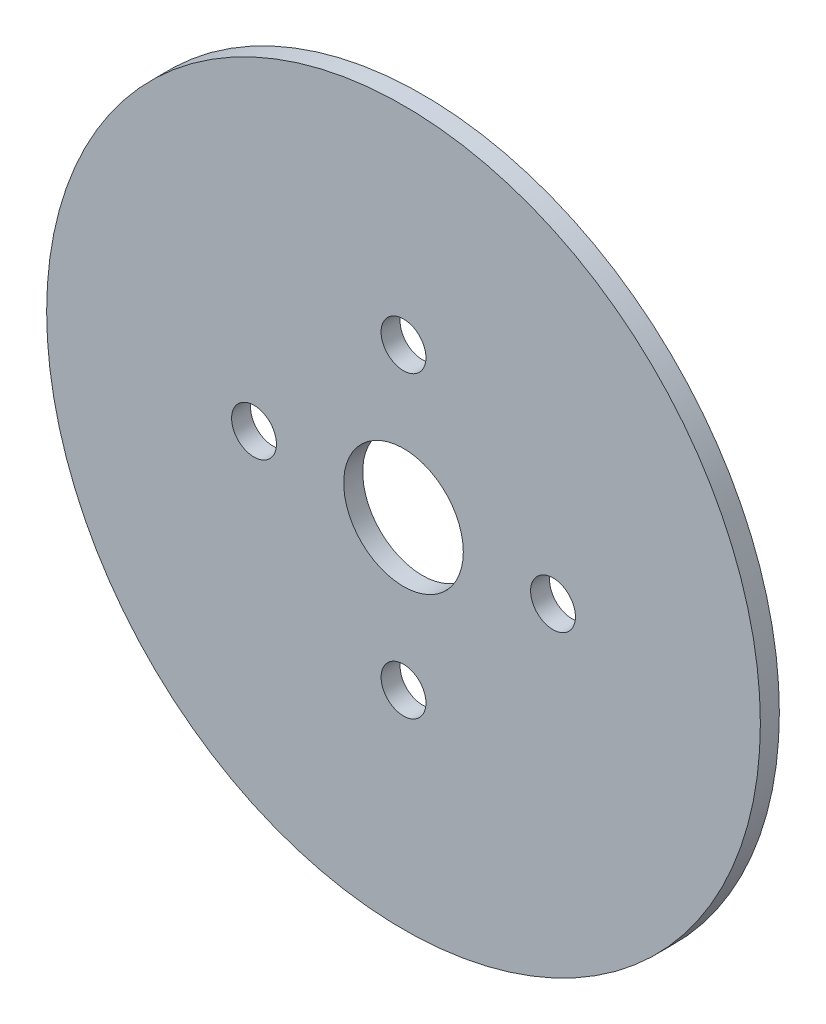
ISO-10303-21;
HEADER;
FILE_DESCRIPTION(('STEP AP214'),'2;1');
FILE_NAME('part.step','',(''),(''),'','','');
FILE_SCHEMA(('AUTOMOTIVE_DESIGN { 1 0 10303 214 1 1 1 1 }'));
ENDSEC;
DATA;
#1=APPLICATION_CONTEXT('core data for automotive mechanical design processes');
#2=APPLICATION_PROTOCOL_DEFINITION('international standard','automotive_design',2000,#1);
#3=PRODUCT_CONTEXT('',#1,'mechanical');
#4=PRODUCT('Part','Part','',(#3));
#5=PRODUCT_RELATED_PRODUCT_CATEGORY('part','',(#4));
#6=PRODUCT_DEFINITION_FORMATION('','',#4);
#7=PRODUCT_DEFINITION_CONTEXT('part definition',#1,'design');
#8=PRODUCT_DEFINITION('design','',#6,#7);
#9=PRODUCT_DEFINITION_SHAPE('','',#8);
#10=(LENGTH_UNIT() NAMED_UNIT(*) SI_UNIT(.MILLI.,.METRE.));
#11=(NAMED_UNIT(*) PLANE_ANGLE_UNIT() SI_UNIT($,.RADIAN.));
#12=(NAMED_UNIT(*) SI_UNIT($,.STERADIAN.) SOLID_ANGLE_UNIT());
#13=UNCERTAINTY_MEASURE_WITH_UNIT(LENGTH_MEASURE(1.E-05),#10,'distance_accuracy_value','');
#14=(GEOMETRIC_REPRESENTATION_CONTEXT(3) GLOBAL_UNCERTAINTY_ASSIGNED_CONTEXT((#13)) GLOBAL_UNIT_ASSIGNED_CONTEXT((#10,
#11,#12)) REPRESENTATION_CONTEXT('',''));
#15=CARTESIAN_POINT('',(0.,0.,0.));
#16=DIRECTION('',(0.,0.,1.));
#17=DIRECTION('',(1.,0.,0.));
#18=AXIS2_PLACEMENT_3D('',#15,#16,#17);
#19=CARTESIAN_POINT('',(0.,0.,1.27));
#20=DIRECTION('',(0.,0.,1.));
#21=DIRECTION('',(1.,0.,0.));
#22=AXIS2_PLACEMENT_3D('',#19,#20,#21);
#23=PLANE('',#22);
#24=CARTESIAN_POINT('',(2.8176792204172E-13,-10.,1.27));
#25=DIRECTION('',(0.,0.,1.));
#26=DIRECTION('',(1.,0.,0.));
#27=AXIS2_PLACEMENT_3D('',#24,#25,#26);
#28=CIRCLE('',#27,1.50000000000034);
#29=CARTESIAN_POINT('',(1.50000000000062,-10.,1.27));
#30=VERTEX_POINT('',#29);
#31=EDGE_CURVE('E59',#30,#30,#28,.T.);
#32=ORIENTED_EDGE('',*,*,#31,.F.);
#33=EDGE_LOOP('',(#32));
#34=FACE_BOUND('',#33,.T.);
#35=CARTESIAN_POINT('',(0.,0.,1.27));
#36=DIRECTION('',(0.,0.,1.));
#37=DIRECTION('',(1.,0.,0.));
#38=AXIS2_PLACEMENT_3D('',#35,#36,#37);
#39=CIRCLE('',#38,4.);
#40=CARTESIAN_POINT('',(4.,0.,1.27));
#41=VERTEX_POINT('',#40);
#42=EDGE_CURVE('E47',#41,#41,#39,.T.);
#43=ORIENTED_EDGE('',*,*,#42,.F.);
#44=EDGE_LOOP('',(#43));
#45=FACE_BOUND('',#44,.T.);
#46=CARTESIAN_POINT('',(0.,0.,1.27));
#47=DIRECTION('',(0.,0.,1.));
#48=DIRECTION('',(1.,0.,0.));
#49=AXIS2_PLACEMENT_3D('',#46,#47,#48);
#50=CIRCLE('',#49,23.87);
#51=CARTESIAN_POINT('',(23.87,0.,1.27));
#52=VERTEX_POINT('',#51);
#53=EDGE_CURVE('E10',#52,#52,#50,.T.);
#54=ORIENTED_EDGE('',*,*,#53,.T.);
#55=EDGE_LOOP('',(#54));
#56=FACE_BOUND('',#55,.T.);
#57=CARTESIAN_POINT('',(0.,10.,1.27));
#58=DIRECTION('',(0.,0.,1.));
#59=DIRECTION('',(1.,0.,0.));
#60=AXIS2_PLACEMENT_3D('',#57,#58,#59);
#61=CIRCLE('',#60,1.5);
#62=CARTESIAN_POINT('',(1.5,10.,1.27));
#63=VERTEX_POINT('',#62);
#64=EDGE_CURVE('E42',#63,#63,#61,.T.);
#65=ORIENTED_EDGE('',*,*,#64,.F.);
#66=EDGE_LOOP('',(#65));
#67=FACE_BOUND('',#66,.T.);
#68=CARTESIAN_POINT('',(10.,0.,1.27));
#69=DIRECTION('',(0.,0.,1.));
#70=DIRECTION('',(1.,0.,0.));
#71=AXIS2_PLACEMENT_3D('',#68,#69,#70);
#72=CIRCLE('',#71,1.5);
#73=CARTESIAN_POINT('',(11.5,0.,1.27));
#74=VERTEX_POINT('',#73);
#75=EDGE_CURVE('E53',#74,#74,#72,.T.);
#76=ORIENTED_EDGE('',*,*,#75,.F.);
#77=EDGE_LOOP('',(#76));
#78=FACE_BOUND('',#77,.T.);
#79=CARTESIAN_POINT('',(-9.99999999999986,-1.39659314221713E-13,1.27));
#80=DIRECTION('',(0.,0.,1.));
#81=DIRECTION('',(1.,0.,0.));
#82=AXIS2_PLACEMENT_3D('',#79,#80,#81);
#83=CIRCLE('',#82,1.50000000000027);
#84=CARTESIAN_POINT('',(-8.49999999999959,-1.39659314221713E-13,1.27));
#85=VERTEX_POINT('',#84);
#86=EDGE_CURVE('E65',#85,#85,#83,.T.);
#87=ORIENTED_EDGE('',*,*,#86,.F.);
#88=EDGE_LOOP('',(#87));
#89=FACE_BOUND('',#88,.T.);
#90=ADVANCED_FACE('F31',(#34,#45,#56,#67,#78,#89),#23,.T.);
#91=CARTESIAN_POINT('',(0.,0.,0.));
#92=DIRECTION('',(0.,0.,1.));
#93=DIRECTION('',(1.,0.,0.));
#94=AXIS2_PLACEMENT_3D('',#91,#92,#93);
#95=PLANE('',#94);
#96=CARTESIAN_POINT('',(2.8176792204172E-13,-10.,0.));
#97=DIRECTION('',(0.,0.,1.));
#98=DIRECTION('',(1.,0.,0.));
#99=AXIS2_PLACEMENT_3D('',#96,#97,#98);
#100=CIRCLE('',#99,1.50000000000034);
#101=CARTESIAN_POINT('',(1.50000000000062,-10.,0.));
#102=VERTEX_POINT('',#101);
#103=EDGE_CURVE('E62',#102,#102,#100,.T.);
#104=ORIENTED_EDGE('',*,*,#103,.T.);
#105=EDGE_LOOP('',(#104));
#106=FACE_BOUND('',#105,.T.);
#107=CARTESIAN_POINT('',(0.,0.,0.));
#108=DIRECTION('',(0.,0.,1.));
#109=DIRECTION('',(1.,0.,0.));
#110=AXIS2_PLACEMENT_3D('',#107,#108,#109);
#111=CIRCLE('',#110,4.);
#112=CARTESIAN_POINT('',(4.,0.,0.));
#113=VERTEX_POINT('',#112);
#114=EDGE_CURVE('E50',#113,#113,#111,.T.);
#115=ORIENTED_EDGE('',*,*,#114,.T.);
#116=EDGE_LOOP('',(#115));
#117=FACE_BOUND('',#116,.T.);
#118=CARTESIAN_POINT('',(0.,0.,0.));
#119=DIRECTION('',(0.,0.,1.));
#120=DIRECTION('',(1.,0.,0.));
#121=AXIS2_PLACEMENT_3D('',#118,#119,#120);
#122=CIRCLE('',#121,23.87);
#123=CARTESIAN_POINT('',(23.87,0.,0.));
#124=VERTEX_POINT('',#123);
#125=EDGE_CURVE('E35',#124,#124,#122,.T.);
#126=ORIENTED_EDGE('',*,*,#125,.F.);
#127=EDGE_LOOP('',(#126));
#128=FACE_BOUND('',#127,.T.);
#129=CARTESIAN_POINT('',(0.,10.,0.));
#130=DIRECTION('',(0.,0.,1.));
#131=DIRECTION('',(1.,0.,0.));
#132=AXIS2_PLACEMENT_3D('',#129,#130,#131);
#133=CIRCLE('',#132,1.5);
#134=CARTESIAN_POINT('',(1.5,10.,0.));
#135=VERTEX_POINT('',#134);
#136=EDGE_CURVE('E44',#135,#135,#133,.T.);
#137=ORIENTED_EDGE('',*,*,#136,.T.);
#138=EDGE_LOOP('',(#137));
#139=FACE_BOUND('',#138,.T.);
#140=CARTESIAN_POINT('',(10.,0.,0.));
#141=DIRECTION('',(0.,0.,1.));
#142=DIRECTION('',(1.,0.,0.));
#143=AXIS2_PLACEMENT_3D('',#140,#141,#142);
#144=CIRCLE('',#143,1.5);
#145=CARTESIAN_POINT('',(11.5,0.,0.));
#146=VERTEX_POINT('',#145);
#147=EDGE_CURVE('E56',#146,#146,#144,.T.);
#148=ORIENTED_EDGE('',*,*,#147,.T.);
#149=EDGE_LOOP('',(#148));
#150=FACE_BOUND('',#149,.T.);
#151=CARTESIAN_POINT('',(-9.99999999999986,-1.39659314221713E-13,0.));
#152=DIRECTION('',(0.,0.,1.));
#153=DIRECTION('',(1.,0.,0.));
#154=AXIS2_PLACEMENT_3D('',#151,#152,#153);
#155=CIRCLE('',#154,1.50000000000027);
#156=CARTESIAN_POINT('',(-8.49999999999959,-1.39659314221713E-13,0.));
#157=VERTEX_POINT('',#156);
#158=EDGE_CURVE('E68',#157,#157,#155,.T.);
#159=ORIENTED_EDGE('',*,*,#158,.T.);
#160=EDGE_LOOP('',(#159));
#161=FACE_BOUND('',#160,.T.);
#162=ADVANCED_FACE('F78',(#106,#117,#128,#139,#150,#161),#95,.F.);
#163=CARTESIAN_POINT('',(0.,0.,1.27));
#164=DIRECTION('',(0.,0.,-1.));
#165=DIRECTION('',(-1.,0.,0.));
#166=AXIS2_PLACEMENT_3D('',#163,#164,#165);
#167=CYLINDRICAL_SURFACE('',#166,23.87);
#168=ORIENTED_EDGE('',*,*,#53,.F.);
#169=EDGE_LOOP('',(#168));
#170=FACE_BOUND('',#169,.T.);
#171=ORIENTED_EDGE('',*,*,#125,.T.);
#172=EDGE_LOOP('',(#171));
#173=FACE_BOUND('',#172,.T.);
#174=ADVANCED_FACE('F33',(#170,#173),#167,.T.);
#175=CARTESIAN_POINT('',(0.,10.,1.27));
#176=DIRECTION('',(0.,0.,-1.));
#177=DIRECTION('',(-1.,0.,0.));
#178=AXIS2_PLACEMENT_3D('',#175,#176,#177);
#179=CYLINDRICAL_SURFACE('',#178,1.5);
#180=ORIENTED_EDGE('',*,*,#64,.T.);
#181=EDGE_LOOP('',(#180));
#182=FACE_BOUND('',#181,.T.);
#183=ORIENTED_EDGE('',*,*,#136,.F.);
#184=EDGE_LOOP('',(#183));
#185=FACE_BOUND('',#184,.T.);
#186=ADVANCED_FACE('F88',(#182,#185),#179,.F.);
#187=CARTESIAN_POINT('',(0.,0.,1.27));
#188=DIRECTION('',(0.,0.,-1.));
#189=DIRECTION('',(-1.,0.,0.));
#190=AXIS2_PLACEMENT_3D('',#187,#188,#189);
#191=CYLINDRICAL_SURFACE('',#190,4.);
#192=ORIENTED_EDGE('',*,*,#42,.T.);
#193=EDGE_LOOP('',(#192));
#194=FACE_BOUND('',#193,.T.);
#195=ORIENTED_EDGE('',*,*,#114,.F.);
#196=EDGE_LOOP('',(#195));
#197=FACE_BOUND('',#196,.T.);
#198=ADVANCED_FACE('F91',(#194,#197),#191,.F.);
#199=CARTESIAN_POINT('',(10.,0.,1.27));
#200=DIRECTION('',(0.,0.,-1.));
#201=DIRECTION('',(-1.,0.,0.));
#202=AXIS2_PLACEMENT_3D('',#199,#200,#201);
#203=CYLINDRICAL_SURFACE('',#202,1.5);
#204=ORIENTED_EDGE('',*,*,#75,.T.);
#205=EDGE_LOOP('',(#204));
#206=FACE_BOUND('',#205,.T.);
#207=ORIENTED_EDGE('',*,*,#147,.F.);
#208=EDGE_LOOP('',(#207));
#209=FACE_BOUND('',#208,.T.);
#210=ADVANCED_FACE('F95',(#206,#209),#203,.F.);
#211=CARTESIAN_POINT('',(2.8176792204172E-13,-10.,1.27));
#212=DIRECTION('',(0.,0.,-1.));
#213=DIRECTION('',(-1.,0.,0.));
#214=AXIS2_PLACEMENT_3D('',#211,#212,#213);
#215=CYLINDRICAL_SURFACE('',#214,1.50000000000034);
#216=ORIENTED_EDGE('',*,*,#31,.T.);
#217=EDGE_LOOP('',(#216));
#218=FACE_BOUND('',#217,.T.);
#219=ORIENTED_EDGE('',*,*,#103,.F.);
#220=EDGE_LOOP('',(#219));
#221=FACE_BOUND('',#220,.T.);
#222=ADVANCED_FACE('F99',(#218,#221),#215,.F.);
#223=CARTESIAN_POINT('',(-9.99999999999986,-1.39659314221713E-13,1.27));
#224=DIRECTION('',(0.,0.,-1.));
#225=DIRECTION('',(-1.,0.,0.));
#226=AXIS2_PLACEMENT_3D('',#223,#224,#225);
#227=CYLINDRICAL_SURFACE('',#226,1.50000000000027);
#228=ORIENTED_EDGE('',*,*,#86,.T.);
#229=EDGE_LOOP('',(#228));
#230=FACE_BOUND('',#229,.T.);
#231=ORIENTED_EDGE('',*,*,#158,.F.);
#232=EDGE_LOOP('',(#231));
#233=FACE_BOUND('',#232,.T.);
#234=ADVANCED_FACE('F74',(#230,#233),#227,.F.);
#235=CLOSED_SHELL('',(#90,#162,#174,#186,#198,#210,#222,#234));
#236=MANIFOLD_SOLID_BREP('B2',#235);
#237=ADVANCED_BREP_SHAPE_REPRESENTATION('',(#18,#236),#14);
#238=SHAPE_DEFINITION_REPRESENTATION(#9,#237);
ENDSEC;
END-ISO-10303-21;
